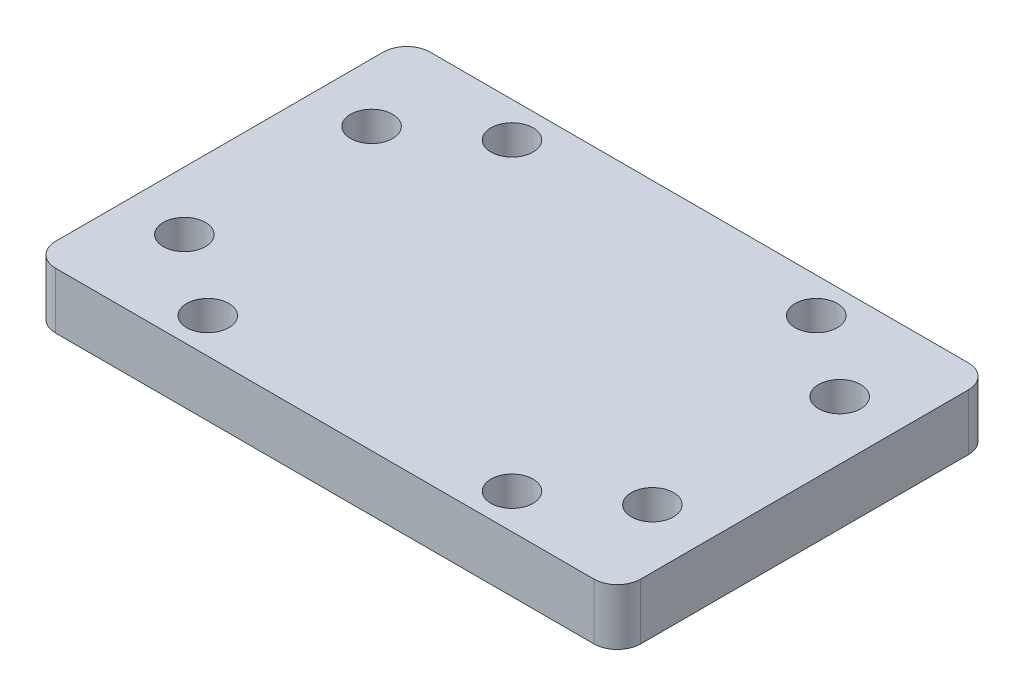
ISO-10303-21;
HEADER;
FILE_DESCRIPTION(('STEP AP214'),'2;1');
FILE_NAME('part.step','',(''),(''),'','','');
FILE_SCHEMA(('AUTOMOTIVE_DESIGN { 1 0 10303 214 1 1 1 1 }'));
ENDSEC;
DATA;
#1=APPLICATION_CONTEXT('core data for automotive mechanical design processes');
#2=APPLICATION_PROTOCOL_DEFINITION('international standard','automotive_design',2000,#1);
#3=PRODUCT_CONTEXT('',#1,'mechanical');
#4=PRODUCT('Part','Part','',(#3));
#5=PRODUCT_RELATED_PRODUCT_CATEGORY('part','',(#4));
#6=PRODUCT_DEFINITION_FORMATION('','',#4);
#7=PRODUCT_DEFINITION_CONTEXT('part definition',#1,'design');
#8=PRODUCT_DEFINITION('design','',#6,#7);
#9=PRODUCT_DEFINITION_SHAPE('','',#8);
#10=(LENGTH_UNIT() NAMED_UNIT(*) SI_UNIT(.MILLI.,.METRE.));
#11=(NAMED_UNIT(*) PLANE_ANGLE_UNIT() SI_UNIT($,.RADIAN.));
#12=(NAMED_UNIT(*) SI_UNIT($,.STERADIAN.) SOLID_ANGLE_UNIT());
#13=UNCERTAINTY_MEASURE_WITH_UNIT(LENGTH_MEASURE(1.E-05),#10,'distance_accuracy_value','');
#14=(GEOMETRIC_REPRESENTATION_CONTEXT(3) GLOBAL_UNCERTAINTY_ASSIGNED_CONTEXT((#13)) GLOBAL_UNIT_ASSIGNED_CONTEXT((#10,
#11,#12)) REPRESENTATION_CONTEXT('',''));
#15=CARTESIAN_POINT('',(0.,0.,0.));
#16=DIRECTION('',(0.,0.,1.));
#17=DIRECTION('',(1.,0.,0.));
#18=AXIS2_PLACEMENT_3D('',#15,#16,#17);
#19=CARTESIAN_POINT('',(62.5,12.,40.));
#20=DIRECTION('',(-1.,0.,0.));
#21=DIRECTION('',(0.,0.,1.));
#22=AXIS2_PLACEMENT_3D('',#19,#20,#21);
#23=PLANE('',#22);
#24=DIRECTION('',(0.,0.,-1.));
#25=VECTOR('',#24,1.);
#26=CARTESIAN_POINT('',(62.5,0.,40.));
#27=LINE('',#26,#25);
#28=CARTESIAN_POINT('',(62.5,0.,35.));
#29=VERTEX_POINT('',#28);
#30=CARTESIAN_POINT('',(62.5,0.,-35.));
#31=VERTEX_POINT('',#30);
#32=EDGE_CURVE('E131',#29,#31,#27,.T.);
#33=ORIENTED_EDGE('',*,*,#32,.T.);
#34=DIRECTION('',(0.,-1.,0.));
#35=VECTOR('',#34,1.);
#36=CARTESIAN_POINT('',(62.5,12.,-35.));
#37=LINE('',#36,#35);
#38=CARTESIAN_POINT('',(62.5,12.,-35.));
#39=VERTEX_POINT('',#38);
#40=EDGE_CURVE('E42',#31,#39,#37,.F.);
#41=ORIENTED_EDGE('',*,*,#40,.T.);
#42=DIRECTION('',(0.,0.,-1.));
#43=VECTOR('',#42,1.);
#44=CARTESIAN_POINT('',(62.5,12.,40.));
#45=LINE('',#44,#43);
#46=CARTESIAN_POINT('',(62.5,12.,35.));
#47=VERTEX_POINT('',#46);
#48=EDGE_CURVE('E129',#47,#39,#45,.T.);
#49=ORIENTED_EDGE('',*,*,#48,.F.);
#50=DIRECTION('',(0.,-1.,0.));
#51=VECTOR('',#50,1.);
#52=CARTESIAN_POINT('',(62.5,12.,35.));
#53=LINE('',#52,#51);
#54=EDGE_CURVE('E155',#47,#29,#53,.T.);
#55=ORIENTED_EDGE('',*,*,#54,.T.);
#56=EDGE_LOOP('',(#33,#41,#49,#55));
#57=FACE_BOUND('',#56,.T.);
#58=ADVANCED_FACE('F34',(#57),#23,.F.);
#59=CARTESIAN_POINT('',(-62.5,12.,-40.));
#60=DIRECTION('',(0.,0.,1.));
#61=DIRECTION('',(1.,0.,0.));
#62=AXIS2_PLACEMENT_3D('',#59,#60,#61);
#63=PLANE('',#62);
#64=DIRECTION('',(-1.,0.,0.));
#65=VECTOR('',#64,1.);
#66=CARTESIAN_POINT('',(-62.5,0.,-40.));
#67=LINE('',#66,#65);
#68=CARTESIAN_POINT('',(57.5,0.,-40.));
#69=VERTEX_POINT('',#68);
#70=CARTESIAN_POINT('',(-57.5,0.,-40.));
#71=VERTEX_POINT('',#70);
#72=EDGE_CURVE('E127',#69,#71,#67,.T.);
#73=ORIENTED_EDGE('',*,*,#72,.T.);
#74=DIRECTION('',(0.,-1.,0.));
#75=VECTOR('',#74,1.);
#76=CARTESIAN_POINT('',(-57.5,12.,-40.));
#77=LINE('',#76,#75);
#78=CARTESIAN_POINT('',(-57.5,12.,-40.));
#79=VERTEX_POINT('',#78);
#80=EDGE_CURVE('E106',#71,#79,#77,.F.);
#81=ORIENTED_EDGE('',*,*,#80,.T.);
#82=DIRECTION('',(-1.,0.,0.));
#83=VECTOR('',#82,1.);
#84=CARTESIAN_POINT('',(-62.5,12.,-40.));
#85=LINE('',#84,#83);
#86=CARTESIAN_POINT('',(57.5,12.,-40.));
#87=VERTEX_POINT('',#86);
#88=EDGE_CURVE('E215',#87,#79,#85,.T.);
#89=ORIENTED_EDGE('',*,*,#88,.F.);
#90=DIRECTION('',(0.,-1.,0.));
#91=VECTOR('',#90,1.);
#92=CARTESIAN_POINT('',(57.5,12.,-40.));
#93=LINE('',#92,#91);
#94=EDGE_CURVE('E111',#87,#69,#93,.T.);
#95=ORIENTED_EDGE('',*,*,#94,.T.);
#96=EDGE_LOOP('',(#73,#81,#89,#95));
#97=FACE_BOUND('',#96,.T.);
#98=ADVANCED_FACE('F232',(#97),#63,.F.);
#99=CARTESIAN_POINT('',(-62.5,12.,40.));
#100=DIRECTION('',(1.,0.,0.));
#101=DIRECTION('',(0.,0.,-1.));
#102=AXIS2_PLACEMENT_3D('',#99,#100,#101);
#103=PLANE('',#102);
#104=DIRECTION('',(0.,0.,1.));
#105=VECTOR('',#104,1.);
#106=CARTESIAN_POINT('',(-62.5,12.,40.));
#107=LINE('',#106,#105);
#108=CARTESIAN_POINT('',(-62.5,12.,-35.));
#109=VERTEX_POINT('',#108);
#110=CARTESIAN_POINT('',(-62.5,12.,35.));
#111=VERTEX_POINT('',#110);
#112=EDGE_CURVE('E120',#109,#111,#107,.T.);
#113=ORIENTED_EDGE('',*,*,#112,.F.);
#114=DIRECTION('',(0.,-1.,0.));
#115=VECTOR('',#114,1.);
#116=CARTESIAN_POINT('',(-62.5,12.,-35.));
#117=LINE('',#116,#115);
#118=CARTESIAN_POINT('',(-62.5,0.,-35.));
#119=VERTEX_POINT('',#118);
#120=EDGE_CURVE('E105',#109,#119,#117,.T.);
#121=ORIENTED_EDGE('',*,*,#120,.T.);
#122=DIRECTION('',(0.,0.,1.));
#123=VECTOR('',#122,1.);
#124=CARTESIAN_POINT('',(-62.5,0.,40.));
#125=LINE('',#124,#123);
#126=CARTESIAN_POINT('',(-62.5,0.,35.));
#127=VERTEX_POINT('',#126);
#128=EDGE_CURVE('E118',#119,#127,#125,.T.);
#129=ORIENTED_EDGE('',*,*,#128,.T.);
#130=DIRECTION('',(0.,-1.,0.));
#131=VECTOR('',#130,1.);
#132=CARTESIAN_POINT('',(-62.5,12.,35.));
#133=LINE('',#132,#131);
#134=EDGE_CURVE('E122',#127,#111,#133,.F.);
#135=ORIENTED_EDGE('',*,*,#134,.T.);
#136=EDGE_LOOP('',(#113,#121,#129,#135));
#137=FACE_BOUND('',#136,.T.);
#138=ADVANCED_FACE('F117',(#137),#103,.F.);
#139=CARTESIAN_POINT('',(-62.5,12.,40.));
#140=DIRECTION('',(0.,0.,-1.));
#141=DIRECTION('',(-1.,0.,0.));
#142=AXIS2_PLACEMENT_3D('',#139,#140,#141);
#143=PLANE('',#142);
#144=DIRECTION('',(1.,0.,0.));
#145=VECTOR('',#144,1.);
#146=CARTESIAN_POINT('',(-62.5,12.,40.));
#147=LINE('',#146,#145);
#148=CARTESIAN_POINT('',(-57.5,12.,40.));
#149=VERTEX_POINT('',#148);
#150=CARTESIAN_POINT('',(57.5,12.,40.));
#151=VERTEX_POINT('',#150);
#152=EDGE_CURVE('E135',#149,#151,#147,.T.);
#153=ORIENTED_EDGE('',*,*,#152,.F.);
#154=DIRECTION('',(0.,-1.,0.));
#155=VECTOR('',#154,1.);
#156=CARTESIAN_POINT('',(-57.5,12.,40.));
#157=LINE('',#156,#155);
#158=CARTESIAN_POINT('',(-57.5,0.,40.));
#159=VERTEX_POINT('',#158);
#160=EDGE_CURVE('E152',#149,#159,#157,.T.);
#161=ORIENTED_EDGE('',*,*,#160,.T.);
#162=DIRECTION('',(1.,0.,0.));
#163=VECTOR('',#162,1.);
#164=CARTESIAN_POINT('',(-62.5,0.,40.));
#165=LINE('',#164,#163);
#166=CARTESIAN_POINT('',(57.5,0.,40.));
#167=VERTEX_POINT('',#166);
#168=EDGE_CURVE('E126',#159,#167,#165,.T.);
#169=ORIENTED_EDGE('',*,*,#168,.T.);
#170=DIRECTION('',(0.,-1.,0.));
#171=VECTOR('',#170,1.);
#172=CARTESIAN_POINT('',(57.5,12.,40.));
#173=LINE('',#172,#171);
#174=EDGE_CURVE('E49',#167,#151,#173,.F.);
#175=ORIENTED_EDGE('',*,*,#174,.T.);
#176=EDGE_LOOP('',(#153,#161,#169,#175));
#177=FACE_BOUND('',#176,.T.);
#178=ADVANCED_FACE('F239',(#177),#143,.F.);
#179=CARTESIAN_POINT('',(0.,12.,0.));
#180=DIRECTION('',(0.,-1.,0.));
#181=DIRECTION('',(0.,0.,-1.));
#182=AXIS2_PLACEMENT_3D('',#179,#180,#181);
#183=PLANE('',#182);
#184=CARTESIAN_POINT('',(-32.5,12.,-32.5));
#185=DIRECTION('',(0.,1.,0.));
#186=DIRECTION('',(0.,0.,1.));
#187=AXIS2_PLACEMENT_3D('',#184,#185,#186);
#188=CIRCLE('',#187,4.49999999999999);
#189=CARTESIAN_POINT('',(-32.5,12.,-28.));
#190=VERTEX_POINT('',#189);
#191=EDGE_CURVE('E185',#190,#190,#188,.T.);
#192=ORIENTED_EDGE('',*,*,#191,.F.);
#193=EDGE_LOOP('',(#192));
#194=FACE_BOUND('',#193,.T.);
#195=CARTESIAN_POINT('',(32.5,12.,-32.5));
#196=DIRECTION('',(0.,1.,0.));
#197=DIRECTION('',(0.,0.,1.));
#198=AXIS2_PLACEMENT_3D('',#195,#196,#197);
#199=CIRCLE('',#198,4.49999999999999);
#200=CARTESIAN_POINT('',(32.5,12.,-28.));
#201=VERTEX_POINT('',#200);
#202=EDGE_CURVE('E182',#201,#201,#199,.T.);
#203=ORIENTED_EDGE('',*,*,#202,.F.);
#204=EDGE_LOOP('',(#203));
#205=FACE_BOUND('',#204,.T.);
#206=CARTESIAN_POINT('',(32.5,12.,32.5));
#207=DIRECTION('',(0.,1.,0.));
#208=DIRECTION('',(0.,0.,1.));
#209=AXIS2_PLACEMENT_3D('',#206,#207,#208);
#210=CIRCLE('',#209,4.49999999999999);
#211=CARTESIAN_POINT('',(32.5,12.,37.));
#212=VERTEX_POINT('',#211);
#213=EDGE_CURVE('E179',#212,#212,#210,.T.);
#214=ORIENTED_EDGE('',*,*,#213,.F.);
#215=EDGE_LOOP('',(#214));
#216=FACE_BOUND('',#215,.T.);
#217=CARTESIAN_POINT('',(-32.5,12.,32.5));
#218=DIRECTION('',(0.,1.,0.));
#219=DIRECTION('',(0.,0.,1.));
#220=AXIS2_PLACEMENT_3D('',#217,#218,#219);
#221=CIRCLE('',#220,4.49999999999999);
#222=CARTESIAN_POINT('',(-32.5,12.,37.));
#223=VERTEX_POINT('',#222);
#224=EDGE_CURVE('E175',#223,#223,#221,.T.);
#225=ORIENTED_EDGE('',*,*,#224,.F.);
#226=EDGE_LOOP('',(#225));
#227=FACE_BOUND('',#226,.T.);
#228=CARTESIAN_POINT('',(-50.,12.,-20.));
#229=DIRECTION('',(0.,1.,0.));
#230=DIRECTION('',(0.,0.,1.));
#231=AXIS2_PLACEMENT_3D('',#228,#229,#230);
#232=CIRCLE('',#231,4.49999999999999);
#233=CARTESIAN_POINT('',(-50.,12.,-15.5));
#234=VERTEX_POINT('',#233);
#235=EDGE_CURVE('E171',#234,#234,#232,.T.);
#236=ORIENTED_EDGE('',*,*,#235,.F.);
#237=EDGE_LOOP('',(#236));
#238=FACE_BOUND('',#237,.T.);
#239=CARTESIAN_POINT('',(50.,12.,-20.));
#240=DIRECTION('',(0.,1.,0.));
#241=DIRECTION('',(0.,0.,1.));
#242=AXIS2_PLACEMENT_3D('',#239,#240,#241);
#243=CIRCLE('',#242,4.49999999999999);
#244=CARTESIAN_POINT('',(50.,12.,-15.5));
#245=VERTEX_POINT('',#244);
#246=EDGE_CURVE('E167',#245,#245,#243,.T.);
#247=ORIENTED_EDGE('',*,*,#246,.F.);
#248=EDGE_LOOP('',(#247));
#249=FACE_BOUND('',#248,.T.);
#250=CARTESIAN_POINT('',(49.9999999999999,12.,20.));
#251=DIRECTION('',(0.,1.,0.));
#252=DIRECTION('',(0.,0.,1.));
#253=AXIS2_PLACEMENT_3D('',#250,#251,#252);
#254=CIRCLE('',#253,4.49999999999999);
#255=CARTESIAN_POINT('',(49.9999999999999,12.,24.5));
#256=VERTEX_POINT('',#255);
#257=EDGE_CURVE('E166',#256,#256,#254,.T.);
#258=ORIENTED_EDGE('',*,*,#257,.F.);
#259=EDGE_LOOP('',(#258));
#260=FACE_BOUND('',#259,.T.);
#261=CARTESIAN_POINT('',(-50.,12.,20.));
#262=DIRECTION('',(0.,1.,0.));
#263=DIRECTION('',(0.,0.,1.));
#264=AXIS2_PLACEMENT_3D('',#261,#262,#263);
#265=CIRCLE('',#264,4.49999999999999);
#266=CARTESIAN_POINT('',(-50.,12.,24.5));
#267=VERTEX_POINT('',#266);
#268=EDGE_CURVE('E162',#267,#267,#265,.T.);
#269=ORIENTED_EDGE('',*,*,#268,.F.);
#270=EDGE_LOOP('',(#269));
#271=FACE_BOUND('',#270,.T.);
#272=ORIENTED_EDGE('',*,*,#88,.T.);
#273=CARTESIAN_POINT('',(-57.5,12.,-35.));
#274=DIRECTION('',(0.,-1.,0.));
#275=DIRECTION('',(0.,0.,-1.));
#276=AXIS2_PLACEMENT_3D('',#273,#274,#275);
#277=CIRCLE('',#276,5.);
#278=EDGE_CURVE('E149',#79,#109,#277,.F.);
#279=ORIENTED_EDGE('',*,*,#278,.T.);
#280=ORIENTED_EDGE('',*,*,#112,.T.);
#281=CARTESIAN_POINT('',(-57.5,12.,35.));
#282=DIRECTION('',(0.,-1.,0.));
#283=DIRECTION('',(0.,0.,-1.));
#284=AXIS2_PLACEMENT_3D('',#281,#282,#283);
#285=CIRCLE('',#284,5.);
#286=EDGE_CURVE('E56',#111,#149,#285,.F.);
#287=ORIENTED_EDGE('',*,*,#286,.T.);
#288=ORIENTED_EDGE('',*,*,#152,.T.);
#289=CARTESIAN_POINT('',(57.5,12.,35.));
#290=DIRECTION('',(0.,-1.,0.));
#291=DIRECTION('',(0.,0.,-1.));
#292=AXIS2_PLACEMENT_3D('',#289,#290,#291);
#293=CIRCLE('',#292,5.);
#294=EDGE_CURVE('E144',#151,#47,#293,.F.);
#295=ORIENTED_EDGE('',*,*,#294,.T.);
#296=ORIENTED_EDGE('',*,*,#48,.T.);
#297=CARTESIAN_POINT('',(57.5,12.,-35.));
#298=DIRECTION('',(0.,-1.,0.));
#299=DIRECTION('',(0.,0.,-1.));
#300=AXIS2_PLACEMENT_3D('',#297,#298,#299);
#301=CIRCLE('',#300,5.);
#302=EDGE_CURVE('E146',#39,#87,#301,.F.);
#303=ORIENTED_EDGE('',*,*,#302,.T.);
#304=EDGE_LOOP('',(#272,#279,#280,#287,#288,#295,#296,#303));
#305=FACE_BOUND('',#304,.T.);
#306=ADVANCED_FACE('F230',(#194,#205,#216,#227,#238,#249,#260,#271,#305),#183,.F.);
#307=CARTESIAN_POINT('',(0.,0.,0.));
#308=DIRECTION('',(0.,-1.,0.));
#309=DIRECTION('',(0.,0.,-1.));
#310=AXIS2_PLACEMENT_3D('',#307,#308,#309);
#311=PLANE('',#310);
#312=CARTESIAN_POINT('',(0.,0.,0.));
#313=DIRECTION('',(0.,-1.,0.));
#314=DIRECTION('',(0.,0.,-1.));
#315=AXIS2_PLACEMENT_3D('',#312,#313,#314);
#316=CIRCLE('',#315,10.);
#317=CARTESIAN_POINT('',(0.,0.,-10.));
#318=VERTEX_POINT('',#317);
#319=EDGE_CURVE('E191',#318,#318,#316,.T.);
#320=ORIENTED_EDGE('',*,*,#319,.F.);
#321=EDGE_LOOP('',(#320));
#322=FACE_BOUND('',#321,.T.);
#323=CARTESIAN_POINT('',(-32.5,0.,-32.5));
#324=DIRECTION('',(0.,-1.,0.));
#325=DIRECTION('',(0.,0.,-1.));
#326=AXIS2_PLACEMENT_3D('',#323,#324,#325);
#327=CIRCLE('',#326,4.49999999999999);
#328=CARTESIAN_POINT('',(-32.5,0.,-37.));
#329=VERTEX_POINT('',#328);
#330=EDGE_CURVE('E183',#329,#329,#327,.T.);
#331=ORIENTED_EDGE('',*,*,#330,.F.);
#332=EDGE_LOOP('',(#331));
#333=FACE_BOUND('',#332,.T.);
#334=CARTESIAN_POINT('',(32.5,0.,-32.5));
#335=DIRECTION('',(0.,-1.,0.));
#336=DIRECTION('',(0.,0.,-1.));
#337=AXIS2_PLACEMENT_3D('',#334,#335,#336);
#338=CIRCLE('',#337,4.49999999999999);
#339=CARTESIAN_POINT('',(32.5,0.,-37.));
#340=VERTEX_POINT('',#339);
#341=EDGE_CURVE('E180',#340,#340,#338,.T.);
#342=ORIENTED_EDGE('',*,*,#341,.F.);
#343=EDGE_LOOP('',(#342));
#344=FACE_BOUND('',#343,.T.);
#345=CARTESIAN_POINT('',(32.5,0.,32.5));
#346=DIRECTION('',(0.,-1.,0.));
#347=DIRECTION('',(0.,0.,-1.));
#348=AXIS2_PLACEMENT_3D('',#345,#346,#347);
#349=CIRCLE('',#348,4.49999999999999);
#350=CARTESIAN_POINT('',(32.5,0.,28.));
#351=VERTEX_POINT('',#350);
#352=EDGE_CURVE('E176',#351,#351,#349,.T.);
#353=ORIENTED_EDGE('',*,*,#352,.F.);
#354=EDGE_LOOP('',(#353));
#355=FACE_BOUND('',#354,.T.);
#356=CARTESIAN_POINT('',(-32.5,0.,32.5));
#357=DIRECTION('',(0.,-1.,0.));
#358=DIRECTION('',(0.,0.,-1.));
#359=AXIS2_PLACEMENT_3D('',#356,#357,#358);
#360=CIRCLE('',#359,4.49999999999999);
#361=CARTESIAN_POINT('',(-32.5,0.,28.));
#362=VERTEX_POINT('',#361);
#363=EDGE_CURVE('E172',#362,#362,#360,.T.);
#364=ORIENTED_EDGE('',*,*,#363,.F.);
#365=EDGE_LOOP('',(#364));
#366=FACE_BOUND('',#365,.T.);
#367=CARTESIAN_POINT('',(-50.,0.,-20.));
#368=DIRECTION('',(0.,-1.,0.));
#369=DIRECTION('',(0.,0.,-1.));
#370=AXIS2_PLACEMENT_3D('',#367,#368,#369);
#371=CIRCLE('',#370,4.49999999999999);
#372=CARTESIAN_POINT('',(-50.,0.,-24.5));
#373=VERTEX_POINT('',#372);
#374=EDGE_CURVE('E168',#373,#373,#371,.T.);
#375=ORIENTED_EDGE('',*,*,#374,.F.);
#376=EDGE_LOOP('',(#375));
#377=FACE_BOUND('',#376,.T.);
#378=CARTESIAN_POINT('',(50.,0.,-20.));
#379=DIRECTION('',(0.,-1.,0.));
#380=DIRECTION('',(0.,0.,-1.));
#381=AXIS2_PLACEMENT_3D('',#378,#379,#380);
#382=CIRCLE('',#381,4.49999999999999);
#383=CARTESIAN_POINT('',(50.,0.,-24.5));
#384=VERTEX_POINT('',#383);
#385=EDGE_CURVE('E163',#384,#384,#382,.T.);
#386=ORIENTED_EDGE('',*,*,#385,.F.);
#387=EDGE_LOOP('',(#386));
#388=FACE_BOUND('',#387,.T.);
#389=CARTESIAN_POINT('',(49.9999999999999,0.,20.));
#390=DIRECTION('',(0.,-1.,0.));
#391=DIRECTION('',(0.,0.,-1.));
#392=AXIS2_PLACEMENT_3D('',#389,#390,#391);
#393=CIRCLE('',#392,4.49999999999999);
#394=CARTESIAN_POINT('',(49.9999999999999,0.,15.5));
#395=VERTEX_POINT('',#394);
#396=EDGE_CURVE('E208',#395,#395,#393,.T.);
#397=ORIENTED_EDGE('',*,*,#396,.F.);
#398=EDGE_LOOP('',(#397));
#399=FACE_BOUND('',#398,.T.);
#400=CARTESIAN_POINT('',(-50.,0.,20.));
#401=DIRECTION('',(0.,-1.,0.));
#402=DIRECTION('',(0.,0.,-1.));
#403=AXIS2_PLACEMENT_3D('',#400,#401,#402);
#404=CIRCLE('',#403,4.49999999999999);
#405=CARTESIAN_POINT('',(-50.,0.,15.5));
#406=VERTEX_POINT('',#405);
#407=EDGE_CURVE('E159',#406,#406,#404,.T.);
#408=ORIENTED_EDGE('',*,*,#407,.F.);
#409=EDGE_LOOP('',(#408));
#410=FACE_BOUND('',#409,.T.);
#411=ORIENTED_EDGE('',*,*,#128,.F.);
#412=CARTESIAN_POINT('',(-57.5,0.,-35.));
#413=DIRECTION('',(0.,-1.,0.));
#414=DIRECTION('',(0.,0.,-1.));
#415=AXIS2_PLACEMENT_3D('',#412,#413,#414);
#416=CIRCLE('',#415,5.);
#417=EDGE_CURVE('E101',#119,#71,#416,.T.);
#418=ORIENTED_EDGE('',*,*,#417,.T.);
#419=ORIENTED_EDGE('',*,*,#72,.F.);
#420=CARTESIAN_POINT('',(57.5,0.,-35.));
#421=DIRECTION('',(0.,-1.,0.));
#422=DIRECTION('',(0.,0.,-1.));
#423=AXIS2_PLACEMENT_3D('',#420,#421,#422);
#424=CIRCLE('',#423,5.);
#425=EDGE_CURVE('E138',#69,#31,#424,.T.);
#426=ORIENTED_EDGE('',*,*,#425,.T.);
#427=ORIENTED_EDGE('',*,*,#32,.F.);
#428=CARTESIAN_POINT('',(57.5,0.,35.));
#429=DIRECTION('',(0.,-1.,0.));
#430=DIRECTION('',(0.,0.,-1.));
#431=AXIS2_PLACEMENT_3D('',#428,#429,#430);
#432=CIRCLE('',#431,5.);
#433=EDGE_CURVE('E121',#29,#167,#432,.T.);
#434=ORIENTED_EDGE('',*,*,#433,.T.);
#435=ORIENTED_EDGE('',*,*,#168,.F.);
#436=CARTESIAN_POINT('',(-57.5,0.,35.));
#437=DIRECTION('',(0.,-1.,0.));
#438=DIRECTION('',(0.,0.,-1.));
#439=AXIS2_PLACEMENT_3D('',#436,#437,#438);
#440=CIRCLE('',#439,5.);
#441=EDGE_CURVE('E112',#159,#127,#440,.T.);
#442=ORIENTED_EDGE('',*,*,#441,.T.);
#443=EDGE_LOOP('',(#411,#418,#419,#426,#427,#434,#435,#442));
#444=FACE_BOUND('',#443,.T.);
#445=ADVANCED_FACE('F124',(#322,#333,#344,#355,#366,#377,#388,#399,#410,#444),#311,.T.);
#446=CARTESIAN_POINT('',(-57.5,12.,-35.));
#447=DIRECTION('',(0.,-1.,0.));
#448=DIRECTION('',(0.,0.,-1.));
#449=AXIS2_PLACEMENT_3D('',#446,#447,#448);
#450=CYLINDRICAL_SURFACE('',#449,5.);
#451=ORIENTED_EDGE('',*,*,#278,.F.);
#452=ORIENTED_EDGE('',*,*,#80,.F.);
#453=ORIENTED_EDGE('',*,*,#417,.F.);
#454=ORIENTED_EDGE('',*,*,#120,.F.);
#455=EDGE_LOOP('',(#451,#452,#453,#454));
#456=FACE_BOUND('',#455,.T.);
#457=ADVANCED_FACE('F104',(#456),#450,.T.);
#458=CARTESIAN_POINT('',(-57.5,12.,35.));
#459=DIRECTION('',(0.,-1.,0.));
#460=DIRECTION('',(0.,0.,-1.));
#461=AXIS2_PLACEMENT_3D('',#458,#459,#460);
#462=CYLINDRICAL_SURFACE('',#461,5.);
#463=ORIENTED_EDGE('',*,*,#286,.F.);
#464=ORIENTED_EDGE('',*,*,#134,.F.);
#465=ORIENTED_EDGE('',*,*,#441,.F.);
#466=ORIENTED_EDGE('',*,*,#160,.F.);
#467=EDGE_LOOP('',(#463,#464,#465,#466));
#468=FACE_BOUND('',#467,.T.);
#469=ADVANCED_FACE('F246',(#468),#462,.T.);
#470=CARTESIAN_POINT('',(57.5,12.,-35.));
#471=DIRECTION('',(0.,-1.,0.));
#472=DIRECTION('',(0.,0.,-1.));
#473=AXIS2_PLACEMENT_3D('',#470,#471,#472);
#474=CYLINDRICAL_SURFACE('',#473,5.);
#475=ORIENTED_EDGE('',*,*,#302,.F.);
#476=ORIENTED_EDGE('',*,*,#40,.F.);
#477=ORIENTED_EDGE('',*,*,#425,.F.);
#478=ORIENTED_EDGE('',*,*,#94,.F.);
#479=EDGE_LOOP('',(#475,#476,#477,#478));
#480=FACE_BOUND('',#479,.T.);
#481=ADVANCED_FACE('F227',(#480),#474,.T.);
#482=CARTESIAN_POINT('',(57.5,12.,35.));
#483=DIRECTION('',(0.,-1.,0.));
#484=DIRECTION('',(0.,0.,-1.));
#485=AXIS2_PLACEMENT_3D('',#482,#483,#484);
#486=CYLINDRICAL_SURFACE('',#485,5.);
#487=ORIENTED_EDGE('',*,*,#294,.F.);
#488=ORIENTED_EDGE('',*,*,#174,.F.);
#489=ORIENTED_EDGE('',*,*,#433,.F.);
#490=ORIENTED_EDGE('',*,*,#54,.F.);
#491=EDGE_LOOP('',(#487,#488,#489,#490));
#492=FACE_BOUND('',#491,.T.);
#493=ADVANCED_FACE('F251',(#492),#486,.T.);
#494=CARTESIAN_POINT('',(-50.,12.,20.));
#495=DIRECTION('',(0.,1.,0.));
#496=DIRECTION('',(0.,0.,1.));
#497=AXIS2_PLACEMENT_3D('',#494,#495,#496);
#498=CYLINDRICAL_SURFACE('',#497,4.49999999999999);
#499=ORIENTED_EDGE('',*,*,#407,.T.);
#500=EDGE_LOOP('',(#499));
#501=FACE_BOUND('',#500,.T.);
#502=ORIENTED_EDGE('',*,*,#268,.T.);
#503=EDGE_LOOP('',(#502));
#504=FACE_BOUND('',#503,.T.);
#505=ADVANCED_FACE('F253',(#501,#504),#498,.F.);
#506=CARTESIAN_POINT('',(49.9999999999999,12.,20.));
#507=DIRECTION('',(0.,1.,0.));
#508=DIRECTION('',(0.,0.,1.));
#509=AXIS2_PLACEMENT_3D('',#506,#507,#508);
#510=CYLINDRICAL_SURFACE('',#509,4.49999999999999);
#511=ORIENTED_EDGE('',*,*,#396,.T.);
#512=EDGE_LOOP('',(#511));
#513=FACE_BOUND('',#512,.T.);
#514=ORIENTED_EDGE('',*,*,#257,.T.);
#515=EDGE_LOOP('',(#514));
#516=FACE_BOUND('',#515,.T.);
#517=ADVANCED_FACE('F258',(#513,#516),#510,.F.);
#518=CARTESIAN_POINT('',(50.,12.,-20.));
#519=DIRECTION('',(0.,1.,0.));
#520=DIRECTION('',(0.,0.,1.));
#521=AXIS2_PLACEMENT_3D('',#518,#519,#520);
#522=CYLINDRICAL_SURFACE('',#521,4.49999999999999);
#523=ORIENTED_EDGE('',*,*,#385,.T.);
#524=EDGE_LOOP('',(#523));
#525=FACE_BOUND('',#524,.T.);
#526=ORIENTED_EDGE('',*,*,#246,.T.);
#527=EDGE_LOOP('',(#526));
#528=FACE_BOUND('',#527,.T.);
#529=ADVANCED_FACE('F275',(#525,#528),#522,.F.);
#530=CARTESIAN_POINT('',(-50.,12.,-20.));
#531=DIRECTION('',(0.,1.,0.));
#532=DIRECTION('',(0.,0.,1.));
#533=AXIS2_PLACEMENT_3D('',#530,#531,#532);
#534=CYLINDRICAL_SURFACE('',#533,4.49999999999999);
#535=ORIENTED_EDGE('',*,*,#374,.T.);
#536=EDGE_LOOP('',(#535));
#537=FACE_BOUND('',#536,.T.);
#538=ORIENTED_EDGE('',*,*,#235,.T.);
#539=EDGE_LOOP('',(#538));
#540=FACE_BOUND('',#539,.T.);
#541=ADVANCED_FACE('F279',(#537,#540),#534,.F.);
#542=CARTESIAN_POINT('',(-32.5,12.,32.5));
#543=DIRECTION('',(0.,1.,0.));
#544=DIRECTION('',(0.,0.,1.));
#545=AXIS2_PLACEMENT_3D('',#542,#543,#544);
#546=CYLINDRICAL_SURFACE('',#545,4.49999999999999);
#547=ORIENTED_EDGE('',*,*,#363,.T.);
#548=EDGE_LOOP('',(#547));
#549=FACE_BOUND('',#548,.T.);
#550=ORIENTED_EDGE('',*,*,#224,.T.);
#551=EDGE_LOOP('',(#550));
#552=FACE_BOUND('',#551,.T.);
#553=ADVANCED_FACE('F283',(#549,#552),#546,.F.);
#554=CARTESIAN_POINT('',(32.5,12.,32.5));
#555=DIRECTION('',(0.,1.,0.));
#556=DIRECTION('',(0.,0.,1.));
#557=AXIS2_PLACEMENT_3D('',#554,#555,#556);
#558=CYLINDRICAL_SURFACE('',#557,4.49999999999999);
#559=ORIENTED_EDGE('',*,*,#352,.T.);
#560=EDGE_LOOP('',(#559));
#561=FACE_BOUND('',#560,.T.);
#562=ORIENTED_EDGE('',*,*,#213,.T.);
#563=EDGE_LOOP('',(#562));
#564=FACE_BOUND('',#563,.T.);
#565=ADVANCED_FACE('F287',(#561,#564),#558,.F.);
#566=CARTESIAN_POINT('',(32.5,12.,-32.5));
#567=DIRECTION('',(0.,1.,0.));
#568=DIRECTION('',(0.,0.,1.));
#569=AXIS2_PLACEMENT_3D('',#566,#567,#568);
#570=CYLINDRICAL_SURFACE('',#569,4.49999999999999);
#571=ORIENTED_EDGE('',*,*,#341,.T.);
#572=EDGE_LOOP('',(#571));
#573=FACE_BOUND('',#572,.T.);
#574=ORIENTED_EDGE('',*,*,#202,.T.);
#575=EDGE_LOOP('',(#574));
#576=FACE_BOUND('',#575,.T.);
#577=ADVANCED_FACE('F291',(#573,#576),#570,.F.);
#578=CARTESIAN_POINT('',(-32.5,12.,-32.5));
#579=DIRECTION('',(0.,1.,0.));
#580=DIRECTION('',(0.,0.,1.));
#581=AXIS2_PLACEMENT_3D('',#578,#579,#580);
#582=CYLINDRICAL_SURFACE('',#581,4.49999999999999);
#583=ORIENTED_EDGE('',*,*,#330,.T.);
#584=EDGE_LOOP('',(#583));
#585=FACE_BOUND('',#584,.T.);
#586=ORIENTED_EDGE('',*,*,#191,.T.);
#587=EDGE_LOOP('',(#586));
#588=FACE_BOUND('',#587,.T.);
#589=ADVANCED_FACE('F295',(#585,#588),#582,.F.);
#590=CARTESIAN_POINT('',(0.,1.5,0.));
#591=DIRECTION('',(0.,-1.,0.));
#592=DIRECTION('',(0.,0.,-1.));
#593=AXIS2_PLACEMENT_3D('',#590,#591,#592);
#594=PLANE('',#593);
#595=CARTESIAN_POINT('',(0.,1.5,0.));
#596=DIRECTION('',(0.,-1.,0.));
#597=DIRECTION('',(0.,0.,-1.));
#598=AXIS2_PLACEMENT_3D('',#595,#596,#597);
#599=CIRCLE('',#598,8.5);
#600=CARTESIAN_POINT('',(0.,1.5,-8.5));
#601=VERTEX_POINT('',#600);
#602=EDGE_CURVE('E11',#601,#601,#599,.T.);
#603=ORIENTED_EDGE('',*,*,#602,.T.);
#604=EDGE_LOOP('',(#603));
#605=FACE_BOUND('',#604,.T.);
#606=ADVANCED_FACE('F299',(#605),#594,.T.);
#607=CARTESIAN_POINT('',(0.,0.,0.));
#608=DIRECTION('',(0.,-1.,0.));
#609=DIRECTION('',(0.,0.,-1.));
#610=AXIS2_PLACEMENT_3D('',#607,#608,#609);
#611=TOROIDAL_SURFACE('',#610,8.5,1.5);
#612=ORIENTED_EDGE('',*,*,#319,.T.);
#613=EDGE_LOOP('',(#612));
#614=FACE_BOUND('',#613,.T.);
#615=ORIENTED_EDGE('',*,*,#602,.F.);
#616=EDGE_LOOP('',(#615));
#617=FACE_BOUND('',#616,.T.);
#618=ADVANCED_FACE('F36',(#614,#617),#611,.F.);
#619=CLOSED_SHELL('',(#58,#98,#138,#178,#306,#445,#457,#469,#481,#493,#505,#517,#529,#541,#553,
#565,#577,#589,#606,#618));
#620=MANIFOLD_SOLID_BREP('B2',#619);
#621=ADVANCED_BREP_SHAPE_REPRESENTATION('',(#18,#620),#14);
#622=SHAPE_DEFINITION_REPRESENTATION(#9,#621);
ENDSEC;
END-ISO-10303-21;
